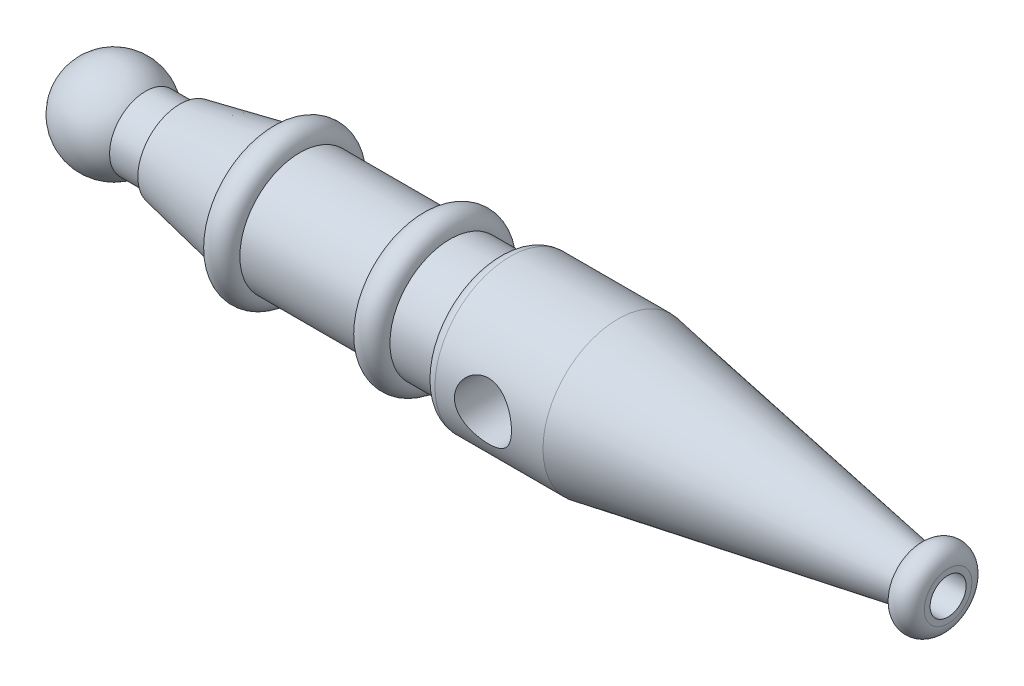
ISO-10303-21;
HEADER;
FILE_DESCRIPTION(('STEP AP214'),'2;1');
FILE_NAME('part.step','',(''),(''),'','','');
FILE_SCHEMA(('AUTOMOTIVE_DESIGN { 1 0 10303 214 1 1 1 1 }'));
ENDSEC;
DATA;
#1=APPLICATION_CONTEXT('core data for automotive mechanical design processes');
#2=APPLICATION_PROTOCOL_DEFINITION('international standard','automotive_design',2000,#1);
#3=PRODUCT_CONTEXT('',#1,'mechanical');
#4=PRODUCT('Part','Part','',(#3));
#5=PRODUCT_RELATED_PRODUCT_CATEGORY('part','',(#4));
#6=PRODUCT_DEFINITION_FORMATION('','',#4);
#7=PRODUCT_DEFINITION_CONTEXT('part definition',#1,'design');
#8=PRODUCT_DEFINITION('design','',#6,#7);
#9=PRODUCT_DEFINITION_SHAPE('','',#8);
#10=(LENGTH_UNIT() NAMED_UNIT(*) SI_UNIT(.MILLI.,.METRE.));
#11=(NAMED_UNIT(*) PLANE_ANGLE_UNIT() SI_UNIT($,.RADIAN.));
#12=(NAMED_UNIT(*) SI_UNIT($,.STERADIAN.) SOLID_ANGLE_UNIT());
#13=UNCERTAINTY_MEASURE_WITH_UNIT(LENGTH_MEASURE(1.E-05),#10,'distance_accuracy_value','');
#14=(GEOMETRIC_REPRESENTATION_CONTEXT(3) GLOBAL_UNCERTAINTY_ASSIGNED_CONTEXT((#13)) GLOBAL_UNIT_ASSIGNED_CONTEXT((#10,
#11,#12)) REPRESENTATION_CONTEXT('',''));
#15=CARTESIAN_POINT('',(0.,0.,0.));
#16=DIRECTION('',(0.,0.,1.));
#17=DIRECTION('',(1.,0.,0.));
#18=AXIS2_PLACEMENT_3D('',#15,#16,#17);
#19=CARTESIAN_POINT('',(-42.8918918918919,0.,0.));
#20=DIRECTION('',(-1.,0.,0.));
#21=DIRECTION('',(0.,1.,0.));
#22=AXIS2_PLACEMENT_3D('',#19,#20,#21);
#23=SPHERICAL_SURFACE('',#22,8.);
#24=CARTESIAN_POINT('',(-37.6003892697627,0.,0.));
#25=DIRECTION('',(-1.,0.,0.));
#26=DIRECTION('',(0.,0.,1.));
#27=AXIS2_PLACEMENT_3D('',#24,#25,#26);
#28=CIRCLE('',#27,6.);
#29=CARTESIAN_POINT('',(-37.6003892697627,0.,6.));
#30=VERTEX_POINT('',#29);
#31=EDGE_CURVE('E122',#30,#30,#28,.T.);
#32=ORIENTED_EDGE('',*,*,#31,.T.);
#33=EDGE_LOOP('',(#32));
#34=FACE_BOUND('',#33,.T.);
#35=ADVANCED_FACE('F37',(#34),#23,.T.);
#36=CARTESIAN_POINT('',(96.1081081081081,0.,0.));
#37=DIRECTION('',(1.,0.,0.));
#38=DIRECTION('',(0.,0.,-1.));
#39=AXIS2_PLACEMENT_3D('',#36,#37,#38);
#40=PLANE('',#39);
#41=CARTESIAN_POINT('',(96.1081081081081,0.,0.));
#42=DIRECTION('',(1.,0.,0.));
#43=DIRECTION('',(0.,0.,-1.));
#44=AXIS2_PLACEMENT_3D('',#41,#42,#43);
#45=CIRCLE('',#44,3.);
#46=CARTESIAN_POINT('',(96.1081081081081,0.,-3.));
#47=VERTEX_POINT('',#46);
#48=EDGE_CURVE('E132',#47,#47,#45,.T.);
#49=ORIENTED_EDGE('',*,*,#48,.F.);
#50=EDGE_LOOP('',(#49));
#51=FACE_BOUND('',#50,.T.);
#52=CARTESIAN_POINT('',(96.1081081081081,0.,0.));
#53=DIRECTION('',(-1.,0.,0.));
#54=DIRECTION('',(0.,0.,1.));
#55=AXIS2_PLACEMENT_3D('',#52,#53,#54);
#56=CIRCLE('',#55,3.95945945945945);
#57=CARTESIAN_POINT('',(96.1081081081081,0.,3.95945945945945));
#58=VERTEX_POINT('',#57);
#59=EDGE_CURVE('E49',#58,#58,#56,.T.);
#60=ORIENTED_EDGE('',*,*,#59,.F.);
#61=EDGE_LOOP('',(#60));
#62=FACE_BOUND('',#61,.T.);
#63=ADVANCED_FACE('F113',(#51,#62),#40,.T.);
#64=CARTESIAN_POINT('',(93.6081081081081,0.,0.));
#65=DIRECTION('',(-1.,0.,0.));
#66=DIRECTION('',(0.,0.,1.));
#67=AXIS2_PLACEMENT_3D('',#64,#65,#66);
#68=TOROIDAL_SURFACE('',#67,3.95945945945945,2.5);
#69=CARTESIAN_POINT('',(91.1081081081081,0.,0.));
#70=DIRECTION('',(-1.,0.,0.));
#71=DIRECTION('',(0.,0.,1.));
#72=AXIS2_PLACEMENT_3D('',#69,#70,#71);
#73=CIRCLE('',#72,3.95945945945945);
#74=CARTESIAN_POINT('',(91.1081081081081,0.,3.95945945945945));
#75=VERTEX_POINT('',#74);
#76=EDGE_CURVE('E53',#75,#75,#73,.T.);
#77=ORIENTED_EDGE('',*,*,#76,.F.);
#78=EDGE_LOOP('',(#77));
#79=FACE_BOUND('',#78,.T.);
#80=ORIENTED_EDGE('',*,*,#59,.T.);
#81=EDGE_LOOP('',(#80));
#82=FACE_BOUND('',#81,.T.);
#83=ADVANCED_FACE('F118',(#79,#82),#68,.T.);
#84=CARTESIAN_POINT('',(41.1081081081081,0.,0.));
#85=DIRECTION('',(-1.,0.,0.));
#86=DIRECTION('',(0.,0.,1.));
#87=AXIS2_PLACEMENT_3D('',#84,#85,#86);
#88=CONICAL_SURFACE('',#87,12.5,0.169178087982728);
#89=CARTESIAN_POINT('',(41.1081081081081,0.,0.));
#90=DIRECTION('',(-1.,0.,0.));
#91=DIRECTION('',(0.,0.,1.));
#92=AXIS2_PLACEMENT_3D('',#89,#90,#91);
#93=CIRCLE('',#92,12.5);
#94=CARTESIAN_POINT('',(41.1081081081081,0.,12.5));
#95=VERTEX_POINT('',#94);
#96=EDGE_CURVE('E157',#95,#95,#93,.T.);
#97=CARTESIAN_POINT('',(91.1081081081081,0.,3.95945945945945));
#98=CARTESIAN_POINT('',(90.5872747747748,0.,4.04842342342341));
#99=CARTESIAN_POINT('',(90.0664414414415,0.,4.13738738738737));
#100=CARTESIAN_POINT('',(89.0247747747748,0.,4.3153153153153));
#101=CARTESIAN_POINT('',(88.5039414414415,0.,4.40427927927927));
#102=CARTESIAN_POINT('',(87.4622747747748,0.,4.5822072072072));
#103=CARTESIAN_POINT('',(86.9414414414415,0.,4.67117117117116));
#104=CARTESIAN_POINT('',(85.8997747747748,0.,4.84909909909909));
#105=CARTESIAN_POINT('',(85.3789414414415,0.,4.93806306306305));
#106=CARTESIAN_POINT('',(84.3372747747748,0.,5.11599099099098));
#107=CARTESIAN_POINT('',(83.8164414414415,0.,5.20495495495494));
#108=CARTESIAN_POINT('',(82.7747747747748,0.,5.38288288288287));
#109=CARTESIAN_POINT('',(82.2539414414415,0.,5.47184684684684));
#110=CARTESIAN_POINT('',(81.2122747747748,0.,5.64977477477476));
#111=CARTESIAN_POINT('',(80.6914414414415,0.,5.73873873873873));
#112=CARTESIAN_POINT('',(79.6497747747748,0.,5.91666666666666));
#113=CARTESIAN_POINT('',(79.1289414414415,0.,6.00563063063062));
#114=CARTESIAN_POINT('',(78.0872747747748,0.,6.18355855855855));
#115=CARTESIAN_POINT('',(77.5664414414415,0.,6.27252252252251));
#116=CARTESIAN_POINT('',(76.5247747747748,0.,6.45045045045044));
#117=CARTESIAN_POINT('',(76.0039414414415,0.,6.5394144144144));
#118=CARTESIAN_POINT('',(74.9622747747748,0.,6.71734234234233));
#119=CARTESIAN_POINT('',(74.4414414414415,0.,6.8063063063063));
#120=CARTESIAN_POINT('',(73.3997747747748,0.,6.98423423423423));
#121=CARTESIAN_POINT('',(72.8789414414415,0.,7.07319819819819));
#122=CARTESIAN_POINT('',(71.8372747747748,0.,7.25112612612612));
#123=CARTESIAN_POINT('',(71.3164414414415,0.,7.34009009009008));
#124=CARTESIAN_POINT('',(70.2747747747748,0.,7.51801801801801));
#125=CARTESIAN_POINT('',(69.7539414414415,0.,7.60698198198197));
#126=CARTESIAN_POINT('',(68.7122747747748,0.,7.7849099099099));
#127=CARTESIAN_POINT('',(68.1914414414415,0.,7.87387387387387));
#128=CARTESIAN_POINT('',(67.1497747747748,0.,8.05180180180179));
#129=CARTESIAN_POINT('',(66.6289414414415,0.,8.14076576576576));
#130=CARTESIAN_POINT('',(65.5872747747748,0.,8.31869369369369));
#131=CARTESIAN_POINT('',(65.0664414414415,0.,8.40765765765765));
#132=CARTESIAN_POINT('',(64.0247747747748,0.,8.58558558558558));
#133=CARTESIAN_POINT('',(63.5039414414415,0.,8.67454954954954));
#134=CARTESIAN_POINT('',(62.4622747747748,0.,8.85247747747747));
#135=CARTESIAN_POINT('',(61.9414414414415,0.,8.94144144144144));
#136=CARTESIAN_POINT('',(60.8997747747748,0.,9.11936936936936));
#137=CARTESIAN_POINT('',(60.3789414414415,0.,9.20833333333333));
#138=CARTESIAN_POINT('',(59.3372747747748,0.,9.38626126126126));
#139=CARTESIAN_POINT('',(58.8164414414415,0.,9.47522522522522));
#140=CARTESIAN_POINT('',(57.7747747747748,0.,9.65315315315315));
#141=CARTESIAN_POINT('',(57.2539414414415,0.,9.74211711711711));
#142=CARTESIAN_POINT('',(56.2122747747748,0.,9.92004504504504));
#143=CARTESIAN_POINT('',(55.6914414414415,0.,10.009009009009));
#144=CARTESIAN_POINT('',(54.6497747747748,0.,10.1869369369369));
#145=CARTESIAN_POINT('',(54.1289414414415,0.,10.2759009009009));
#146=CARTESIAN_POINT('',(53.0872747747748,0.,10.4538288288288));
#147=CARTESIAN_POINT('',(52.5664414414414,0.,10.5427927927928));
#148=CARTESIAN_POINT('',(51.5247747747748,0.,10.7207207207207));
#149=CARTESIAN_POINT('',(51.0039414414414,0.,10.8096846846847));
#150=CARTESIAN_POINT('',(49.9622747747748,0.,10.9876126126126));
#151=CARTESIAN_POINT('',(49.4414414414415,0.,11.0765765765766));
#152=CARTESIAN_POINT('',(48.3997747747748,0.,11.2545045045045));
#153=CARTESIAN_POINT('',(47.8789414414415,0.,11.3434684684685));
#154=CARTESIAN_POINT('',(46.8372747747748,0.,11.5213963963964));
#155=CARTESIAN_POINT('',(46.3164414414415,0.,11.6103603603604));
#156=CARTESIAN_POINT('',(45.2747747747748,0.,11.7882882882883));
#157=CARTESIAN_POINT('',(44.7539414414414,0.,11.8772522522523));
#158=CARTESIAN_POINT('',(43.7122747747748,0.,12.0551801801802));
#159=CARTESIAN_POINT('',(43.1914414414414,0.,12.1441441441441));
#160=CARTESIAN_POINT('',(42.1497747747748,0.,12.3220720720721));
#161=CARTESIAN_POINT('',(41.6289414414414,0.,12.411036036036));
#162=CARTESIAN_POINT('',(41.1081081081081,0.,12.5));
#163=B_SPLINE_CURVE_WITH_KNOTS('',3,(#97,#98,#99,#100,#101,#102,#103,#104,#105,#106,#107,#108,
#109,#110,#111,#112,#113,#114,#115,#116,#117,#118,#119,#120,#121,#122,#123,#124,#125,#126,#127,
#128,#129,#130,#131,#132,#133,#134,#135,#136,#137,#138,#139,#140,#141,#142,#143,#144,#145,#146,
#147,#148,#149,#150,#151,#152,#153,#154,#155,#156,#157,#158,#159,#160,#161,#162),.UNSPECIFIED.,
.F.,.F.,(4,2,2,2,2,2,2,2,2,2,2,2,2,2,2,2,2,2,2,2,2,2,2,2,2,2,2,2,2,2,2,2,4),(0.,
1.58513013092227,3.17026026184453,4.75539039276679,6.34052052368906,7.92565065461132,
9.51078078553359,11.0959109164558,12.6810410473781,14.2661711783004,15.8513013092227,
17.4364314401449,19.0215615710672,20.6066917019894,22.1918218329117,23.776951963834,
25.3620820947562,26.9472122256785,28.5323423566008,30.117472487523,31.7026026184453,
33.2877327493676,34.8728628802898,36.4579930112121,38.0431231421343,39.6282532730566,
41.2133834039789,42.7985135349011,44.3836436658234,45.9687737967457,47.5539039276679,
49.1390340585902,50.7241641895125),.UNSPECIFIED.);
#164=EDGE_CURVE('BSEAM108',#75,#95,#163,.T.);
#165=ORIENTED_EDGE('',*,*,#76,.T.);
#166=ORIENTED_EDGE('',*,*,#96,.F.);
#167=ORIENTED_EDGE('',*,*,#164,.T.);
#168=ORIENTED_EDGE('',*,*,#164,.F.);
#169=EDGE_LOOP('',(#165,#167,#166,#168));
#170=FACE_BOUND('',#169,.T.);
#171=ADVANCED_FACE('F108',(#170),#88,.T.);
#172=CARTESIAN_POINT('',(-66.054054054054,0.,0.));
#173=DIRECTION('',(-1.,0.,0.));
#174=DIRECTION('',(0.,0.,1.));
#175=AXIS2_PLACEMENT_3D('',#172,#173,#174);
#176=CYLINDRICAL_SURFACE('',#175,12.5);
#177=CARTESIAN_POINT('',(35.8581081081081,0.,-12.5));
#178=CARTESIAN_POINT('',(35.8581087826848,-0.128466446938815,-12.5000005012393));
#179=CARTESIAN_POINT('',(35.8528924916972,-0.256923646186463,-12.4980153397341));
#180=CARTESIAN_POINT('',(35.8320799764197,-0.512917273918687,-12.4901287481548));
#181=CARTESIAN_POINT('',(35.8164804911744,-0.64045340040638,-12.4842260877492));
#182=CARTESIAN_POINT('',(35.7750673896663,-0.893546659172997,-12.4686664063571));
#183=CARTESIAN_POINT('',(35.7492594874675,-1.0191048577656,-12.4590114857153));
#184=CARTESIAN_POINT('',(35.6876705805666,-1.26747251190663,-12.436200181148));
#185=CARTESIAN_POINT('',(35.6518856986213,-1.39028087873356,-12.4230424360485));
#186=CARTESIAN_POINT('',(35.5707662960859,-1.63198891229308,-12.3936028937675));
#187=CARTESIAN_POINT('',(35.5254548046733,-1.75089721971284,-12.3773286386008));
#188=CARTESIAN_POINT('',(35.4256185544062,-1.98437662723286,-12.3420509918013));
#189=CARTESIAN_POINT('',(35.3710903783393,-2.09894609929437,-12.3230465883222));
#190=CARTESIAN_POINT('',(35.194298714892,-2.4350590912118,-12.2626315047553));
#191=CARTESIAN_POINT('',(35.0587657364527,-2.64919164725328,-12.2177954028037));
#192=CARTESIAN_POINT('',(34.7502728262016,-3.06037548532479,-12.1214921926306));
#193=CARTESIAN_POINT('',(34.5760552544378,-3.25642969187666,-12.0698341891123));
#194=CARTESIAN_POINT('',(34.1975892321836,-3.61744362733618,-11.9665936986651));
#195=CARTESIAN_POINT('',(33.9933312642633,-3.78239346378752,-11.9150112409209));
#196=CARTESIAN_POINT('',(33.6639063339606,-4.006122592458,-11.8409250924736));
#197=CARTESIAN_POINT('',(33.547806511672,-4.07787277388981,-11.8163429144165));
#198=CARTESIAN_POINT('',(33.3095250889045,-4.2112796562967,-11.7694568811461));
#199=CARTESIAN_POINT('',(33.1873459577191,-4.27294041244833,-11.7471521119508));
#200=CARTESIAN_POINT('',(32.937682731052,-4.38564983408058,-11.7055410175444));
#201=CARTESIAN_POINT('',(32.8101980581324,-4.43669734080586,-11.6862350197976));
#202=CARTESIAN_POINT('',(32.5508896796704,-4.52766449495391,-11.6512930601117));
#203=CARTESIAN_POINT('',(32.4190681171951,-4.56758954884961,-11.6356553156706));
#204=CARTESIAN_POINT('',(32.1575846460733,-4.63449564115211,-11.6091641155722));
#205=CARTESIAN_POINT('',(32.0280598564847,-4.6619447825455,-11.5981391572528));
#206=CARTESIAN_POINT('',(31.7669368658917,-4.70594997128013,-11.5803540613602));
#207=CARTESIAN_POINT('',(31.6353396034326,-4.72251081207374,-11.5735920471276));
#208=CARTESIAN_POINT('',(31.3710877990251,-4.74456721028894,-11.5645676402429));
#209=CARTESIAN_POINT('',(31.2384334305238,-4.75006454691983,-11.5623045240883));
#210=CARTESIAN_POINT('',(30.9731339540443,-4.74993431563227,-11.5623581029648));
#211=CARTESIAN_POINT('',(30.8404888459084,-4.74430719556798,-11.5646746136269));
#212=CARTESIAN_POINT('',(30.5844877964713,-4.72268848101094,-11.5735187896225));
#213=CARTESIAN_POINT('',(30.4610657498162,-4.70736101442423,-11.5797764994281));
#214=CARTESIAN_POINT('',(30.2160051757954,-4.66712733306709,-11.5960507398756));
#215=CARTESIAN_POINT('',(30.094367253725,-4.64221794208397,-11.6060685168763));
#216=CARTESIAN_POINT('',(29.8537551576655,-4.58305985841391,-11.6295560605714));
#217=CARTESIAN_POINT('',(29.7347803092977,-4.54881355976923,-11.6430249423274));
#218=CARTESIAN_POINT('',(29.5001922406967,-4.47128545414173,-11.6730170411612));
#219=CARTESIAN_POINT('',(29.3845803311509,-4.42800017662867,-11.6895414311263));
#220=CARTESIAN_POINT('',(29.0395622220936,-4.28327874939258,-11.7436925243237));
#221=CARTESIAN_POINT('',(28.8163999751633,-4.1680685108215,-11.7854405393756));
#222=CARTESIAN_POINT('',(28.391936279052,-3.90479581255147,-11.8752623575038));
#223=CARTESIAN_POINT('',(28.1906425555844,-3.75672179858852,-11.9233383829602));
#224=CARTESIAN_POINT('',(27.8008219603139,-3.41982015890273,-12.0244668564206));
#225=CARTESIAN_POINT('',(27.6141408113184,-3.22888228789723,-12.0776335228233));
#226=CARTESIAN_POINT('',(27.2749003194523,-2.81781145947518,-12.1800970946688));
#227=CARTESIAN_POINT('',(27.1223465060623,-2.59767378015137,-12.2293933721734));
#228=CARTESIAN_POINT('',(26.8535661698239,-2.12963147248241,-12.3195902543165));
#229=CARTESIAN_POINT('',(26.7379706396213,-1.88133356641681,-12.360341317423));
#230=CARTESIAN_POINT('',(26.5508099293271,-1.36688022548377,-12.4277426608653));
#231=CARTESIAN_POINT('',(26.4792246461215,-1.10073300558122,-12.4543993784726));
#232=CARTESIAN_POINT('',(26.3857044197549,-0.573677479246094,-12.4894688884553));
#233=CARTESIAN_POINT('',(26.3612818215853,-0.313270964982966,-12.4987947222216));
#234=CARTESIAN_POINT('',(26.3555170395629,0.208057225351658,-12.5009838786683));
#235=CARTESIAN_POINT('',(26.3741649975875,0.468978769883671,-12.4938509684776));
#236=CARTESIAN_POINT('',(26.4521324186027,0.97307793695672,-12.4645257652524));
#237=CARTESIAN_POINT('',(26.5098088930462,1.21654883204225,-12.4429421784921));
#238=CARTESIAN_POINT('',(26.6620196421887,1.69017638420406,-12.38750180738));
#239=CARTESIAN_POINT('',(26.7565587050396,1.92033130718159,-12.3536434286722));
#240=CARTESIAN_POINT('',(26.9828415048187,2.36845004238712,-12.2757374233217));
#241=CARTESIAN_POINT('',(27.1156057858238,2.58584961467165,-12.2314173121275));
#242=CARTESIAN_POINT('',(27.4134339847731,2.99602447185313,-12.137470264806));
#243=CARTESIAN_POINT('',(27.5785100482146,3.18879045219183,-12.0878413363678));
#244=CARTESIAN_POINT('',(27.9477957456243,3.55623210606137,-11.985064504796));
#245=CARTESIAN_POINT('',(28.1537513137022,3.72914496745584,-11.9318831544933));
#246=CARTESIAN_POINT('',(28.592940462394,4.03837087571106,-11.8308123502666));
#247=CARTESIAN_POINT('',(28.8261768512422,4.17468014990191,-11.7829234421247));
#248=CARTESIAN_POINT('',(29.1924666044065,4.34871299636099,-11.7193224978098));
#249=CARTESIAN_POINT('',(29.3177222706582,4.40177044148724,-11.6994448738917));
#250=CARTESIAN_POINT('',(29.5727489211335,4.49707330691068,-11.6631444504838));
#251=CARTESIAN_POINT('',(29.7025179493799,4.53932334614442,-11.6467201756163));
#252=CARTESIAN_POINT('',(29.9655832342649,4.61256770312462,-11.6179072708148));
#253=CARTESIAN_POINT('',(30.0988783541278,4.64356560212121,-11.605517356983));
#254=CARTESIAN_POINT('',(30.367977791247,4.69397900786603,-11.5852191698974));
#255=CARTESIAN_POINT('',(30.5037819261215,4.71339535309547,-11.5773105722075));
#256=CARTESIAN_POINT('',(30.7677364114647,4.73952098873367,-11.5666383982182));
#257=CARTESIAN_POINT('',(30.8958003507804,4.74698436529658,-11.5635697011122));
#258=CARTESIAN_POINT('',(31.1521896617085,4.75152604134758,-11.5617043526346));
#259=CARTESIAN_POINT('',(31.2805151068561,4.74860084160406,-11.5629091407203));
#260=CARTESIAN_POINT('',(31.5363363386622,4.73239263611602,-11.5695520918507));
#261=CARTESIAN_POINT('',(31.6638324911517,4.71911456118937,-11.5749882396016));
#262=CARTESIAN_POINT('',(31.9171480940848,4.68234374170501,-11.5899115396728));
#263=CARTESIAN_POINT('',(32.042966894612,4.65884714995236,-11.5994002177163));
#264=CARTESIAN_POINT('',(32.2879134196684,4.60280569614165,-11.6217493591521));
#265=CARTESIAN_POINT('',(32.4071254865411,4.57058127757041,-11.6344896300873));
#266=CARTESIAN_POINT('',(32.6423569012911,4.49708671459059,-11.6630938751032));
#267=CARTESIAN_POINT('',(32.7583751162832,4.45581340583946,-11.6789589417085));
#268=CARTESIAN_POINT('',(33.1005427226305,4.31890542711458,-11.7305847438558));
#269=CARTESIAN_POINT('',(33.320986688609,4.21014074671157,-11.7703937023547));
#270=CARTESIAN_POINT('',(33.7526824948946,3.95413108187676,-11.8589251576371));
#271=CARTESIAN_POINT('',(33.962814161327,3.80514081966396,-11.9080102201227));
#272=CARTESIAN_POINT('',(34.3561654802551,3.47540026707772,-12.0083800053119));
#273=CARTESIAN_POINT('',(34.5393764285961,3.29463974587396,-12.0596654325553));
#274=CARTESIAN_POINT('',(34.7954012006064,2.99746860333467,-12.1357522409645));
#275=CARTESIAN_POINT('',(34.8795470817546,2.89088551968471,-12.1616429270626));
#276=CARTESIAN_POINT('',(35.0385516762022,2.67067948767235,-12.2118876888598));
#277=CARTESIAN_POINT('',(35.1134137737133,2.55705912738511,-12.2362423228947));
#278=CARTESIAN_POINT('',(35.2533237796015,2.32341236076621,-12.2827502759549));
#279=CARTESIAN_POINT('',(35.3183660117062,2.20338230322347,-12.304902319289));
#280=CARTESIAN_POINT('',(35.4380160638499,1.95781549313792,-12.3463538942417));
#281=CARTESIAN_POINT('',(35.4926282814655,1.83228108895004,-12.3656546272692));
#282=CARTESIAN_POINT('',(35.5936613591319,1.56946177531019,-12.4018279997747));
#283=CARTESIAN_POINT('',(35.639462152175,1.43191096979924,-12.4185073179799));
#284=CARTESIAN_POINT('',(35.7183685538687,1.15282973759642,-12.4475159966159));
#285=CARTESIAN_POINT('',(35.7514797768036,1.01130110064607,-12.459847280567));
#286=CARTESIAN_POINT('',(35.8046241767849,0.725505468548198,-12.4797498090044));
#287=CARTESIAN_POINT('',(35.8246599564179,0.58123902423101,-12.4873220007477));
#288=CARTESIAN_POINT('',(35.8514006829041,0.291310969774447,-12.4974464894756));
#289=CARTESIAN_POINT('',(35.8581073433031,0.145649541388969,-12.4999994317171));
#290=CARTESIAN_POINT('',(35.8581081081081,0.,-12.5));
#291=B_SPLINE_CURVE_WITH_KNOTS('',3,(#177,#178,#179,#180,#181,#182,#183,#184,#185,#186,#187,
#188,#189,#190,#191,#192,#193,#194,#195,#196,#197,#198,#199,#200,#201,#202,#203,#204,#205,#206,
#207,#208,#209,#210,#211,#212,#213,#214,#215,#216,#217,#218,#219,#220,#221,#222,#223,#224,#225,
#226,#227,#228,#229,#230,#231,#232,#233,#234,#235,#236,#237,#238,#239,#240,#241,#242,#243,#244,
#245,#246,#247,#248,#249,#250,#251,#252,#253,#254,#255,#256,#257,#258,#259,#260,#261,#262,#263,
#264,#265,#266,#267,#268,#269,#270,#271,#272,#273,#274,#275,#276,#277,#278,#279,#280,#281,#282,
#283,#284,#285,#286,#287,#288,#289,#290),.UNSPECIFIED.,.T.,.F.,(4,2,2,2,2,2,2,2,2,2,2,2,2,2,2,2,
2,2,2,2,2,2,2,2,2,2,2,2,2,2,2,2,2,2,2,2,2,2,2,2,2,2,2,2,2,2,2,2,2,2,2,2,2,2,2,2,4),(0.,
0.385262777799974,0.77064660870562,1.15581502924361,1.541133342657,1.9255307003372,
2.31007089250849,3.07856982350732,3.87715861657318,4.67600096659891,5.0916053736829,
5.50704232710943,5.92252461418109,6.3378045871693,6.73586392525798,7.13374790463235,
7.53156789203284,7.92937186411553,8.30251559168309,8.67578311552742,9.04895502107773,
9.42227047088333,10.1824862468386,10.9429697244626,11.7560474568173,12.5692568328079,
13.3956885513754,14.221742489313,15.0028882340516,15.7838552054487,16.5338374469207,
17.2839171374857,18.0562494365395,18.8288726027406,19.6475421200436,20.4662959838728,
20.8782711750289,21.2900699983604,21.7017376421742,22.1133754784596,22.4978452931976,
22.8824446229406,23.2668608893628,23.6514220110901,24.0234283181464,24.395564921657,
25.139282934915,25.922731508458,26.706432836138,27.1207428294027,27.5349013477699,
27.9492983570996,28.3635202578181,28.8006508375199,29.2375877923426,29.6744377510004,
30.1112315460956),.UNSPECIFIED.);
#292=CARTESIAN_POINT('',(35.8581081081081,0.,-12.5));
#293=VERTEX_POINT('',#292);
#294=EDGE_CURVE('E40',#293,#293,#291,.T.);
#295=ORIENTED_EDGE('',*,*,#294,.F.);
#296=EDGE_LOOP('',(#295));
#297=FACE_BOUND('',#296,.T.);
#298=CARTESIAN_POINT('',(35.8581081081081,0.,12.5));
#299=CARTESIAN_POINT('',(35.8581087826848,0.128466446938815,12.5000005012393));
#300=CARTESIAN_POINT('',(35.8528924916972,0.256923646186463,12.4980153397341));
#301=CARTESIAN_POINT('',(35.8320799764197,0.512917273918687,12.4901287481548));
#302=CARTESIAN_POINT('',(35.8164804911744,0.64045340040638,12.4842260877492));
#303=CARTESIAN_POINT('',(35.7750673896663,0.893546659172997,12.4686664063571));
#304=CARTESIAN_POINT('',(35.7492594874675,1.0191048577656,12.4590114857153));
#305=CARTESIAN_POINT('',(35.6876705805666,1.26747251190663,12.436200181148));
#306=CARTESIAN_POINT('',(35.6518856986213,1.39028087873356,12.4230424360485));
#307=CARTESIAN_POINT('',(35.5707662960859,1.63198891229308,12.3936028937675));
#308=CARTESIAN_POINT('',(35.5254548046733,1.75089721971284,12.3773286386008));
#309=CARTESIAN_POINT('',(35.4256185544062,1.98437662723286,12.3420509918013));
#310=CARTESIAN_POINT('',(35.3710903783393,2.09894609929437,12.3230465883222));
#311=CARTESIAN_POINT('',(35.194298714892,2.4350590912118,12.2626315047553));
#312=CARTESIAN_POINT('',(35.0587657364527,2.64919164725328,12.2177954028037));
#313=CARTESIAN_POINT('',(34.7502728262016,3.06037548532479,12.1214921926306));
#314=CARTESIAN_POINT('',(34.5760552544378,3.25642969187666,12.0698341891123));
#315=CARTESIAN_POINT('',(34.1975892321836,3.61744362733618,11.9665936986651));
#316=CARTESIAN_POINT('',(33.9933312642633,3.78239346378752,11.9150112409209));
#317=CARTESIAN_POINT('',(33.6639063339606,4.006122592458,11.8409250924736));
#318=CARTESIAN_POINT('',(33.547806511672,4.07787277388981,11.8163429144165));
#319=CARTESIAN_POINT('',(33.3095250889045,4.2112796562967,11.7694568811461));
#320=CARTESIAN_POINT('',(33.1873459577191,4.27294041244833,11.7471521119508));
#321=CARTESIAN_POINT('',(32.937682731052,4.38564983408058,11.7055410175444));
#322=CARTESIAN_POINT('',(32.8101980581324,4.43669734080586,11.6862350197976));
#323=CARTESIAN_POINT('',(32.5508896796704,4.52766449495391,11.6512930601117));
#324=CARTESIAN_POINT('',(32.4190681171951,4.56758954884961,11.6356553156706));
#325=CARTESIAN_POINT('',(32.1575846460733,4.63449564115211,11.6091641155722));
#326=CARTESIAN_POINT('',(32.0280598564847,4.6619447825455,11.5981391572528));
#327=CARTESIAN_POINT('',(31.7669368658917,4.70594997128013,11.5803540613602));
#328=CARTESIAN_POINT('',(31.6353396034326,4.72251081207374,11.5735920471276));
#329=CARTESIAN_POINT('',(31.3710877990251,4.74456721028894,11.5645676402429));
#330=CARTESIAN_POINT('',(31.2384334305238,4.75006454691983,11.5623045240883));
#331=CARTESIAN_POINT('',(30.9731339540443,4.74993431563227,11.5623581029648));
#332=CARTESIAN_POINT('',(30.8404888459084,4.74430719556798,11.5646746136269));
#333=CARTESIAN_POINT('',(30.5844877964713,4.72268848101094,11.5735187896225));
#334=CARTESIAN_POINT('',(30.4610657498162,4.70736101442423,11.5797764994281));
#335=CARTESIAN_POINT('',(30.2160051757954,4.66712733306709,11.5960507398756));
#336=CARTESIAN_POINT('',(30.094367253725,4.64221794208397,11.6060685168763));
#337=CARTESIAN_POINT('',(29.8537551576655,4.58305985841391,11.6295560605714));
#338=CARTESIAN_POINT('',(29.7347803092977,4.54881355976923,11.6430249423274));
#339=CARTESIAN_POINT('',(29.5001922406967,4.47128545414173,11.6730170411612));
#340=CARTESIAN_POINT('',(29.3845803311509,4.42800017662867,11.6895414311263));
#341=CARTESIAN_POINT('',(29.0395622220936,4.28327874939258,11.7436925243237));
#342=CARTESIAN_POINT('',(28.8163999751633,4.1680685108215,11.7854405393756));
#343=CARTESIAN_POINT('',(28.391936279052,3.90479581255147,11.8752623575038));
#344=CARTESIAN_POINT('',(28.1906425555844,3.75672179858852,11.9233383829602));
#345=CARTESIAN_POINT('',(27.8008219603139,3.41982015890273,12.0244668564206));
#346=CARTESIAN_POINT('',(27.6141408113184,3.22888228789723,12.0776335228233));
#347=CARTESIAN_POINT('',(27.2749003194523,2.81781145947518,12.1800970946688));
#348=CARTESIAN_POINT('',(27.1223465060623,2.59767378015137,12.2293933721734));
#349=CARTESIAN_POINT('',(26.8535661698239,2.12963147248241,12.3195902543165));
#350=CARTESIAN_POINT('',(26.7379706396213,1.88133356641681,12.360341317423));
#351=CARTESIAN_POINT('',(26.5508099293271,1.36688022548377,12.4277426608653));
#352=CARTESIAN_POINT('',(26.4792246461215,1.10073300558122,12.4543993784726));
#353=CARTESIAN_POINT('',(26.3857044197549,0.573677479246094,12.4894688884553));
#354=CARTESIAN_POINT('',(26.3612818215853,0.313270964982966,12.4987947222216));
#355=CARTESIAN_POINT('',(26.3555170395629,-0.208057225351658,12.5009838786683));
#356=CARTESIAN_POINT('',(26.3741649975875,-0.468978769883671,12.4938509684776));
#357=CARTESIAN_POINT('',(26.4521324186027,-0.97307793695672,12.4645257652524));
#358=CARTESIAN_POINT('',(26.5098088930462,-1.21654883204225,12.4429421784921));
#359=CARTESIAN_POINT('',(26.6620196421887,-1.69017638420406,12.38750180738));
#360=CARTESIAN_POINT('',(26.7565587050396,-1.92033130718159,12.3536434286722));
#361=CARTESIAN_POINT('',(26.9828415048187,-2.36845004238712,12.2757374233217));
#362=CARTESIAN_POINT('',(27.1156057858238,-2.58584961467165,12.2314173121275));
#363=CARTESIAN_POINT('',(27.4134339847731,-2.99602447185313,12.137470264806));
#364=CARTESIAN_POINT('',(27.5785100482146,-3.18879045219183,12.0878413363678));
#365=CARTESIAN_POINT('',(27.9477957456243,-3.55623210606137,11.985064504796));
#366=CARTESIAN_POINT('',(28.1537513137022,-3.72914496745584,11.9318831544933));
#367=CARTESIAN_POINT('',(28.592940462394,-4.03837087571106,11.8308123502666));
#368=CARTESIAN_POINT('',(28.8261768512422,-4.17468014990191,11.7829234421247));
#369=CARTESIAN_POINT('',(29.1924666044065,-4.34871299636099,11.7193224978098));
#370=CARTESIAN_POINT('',(29.3177222706582,-4.40177044148724,11.6994448738917));
#371=CARTESIAN_POINT('',(29.5727489211335,-4.49707330691068,11.6631444504838));
#372=CARTESIAN_POINT('',(29.7025179493799,-4.53932334614442,11.6467201756163));
#373=CARTESIAN_POINT('',(29.9655832342649,-4.61256770312462,11.6179072708148));
#374=CARTESIAN_POINT('',(30.0988783541278,-4.64356560212121,11.605517356983));
#375=CARTESIAN_POINT('',(30.367977791247,-4.69397900786603,11.5852191698974));
#376=CARTESIAN_POINT('',(30.5037819261215,-4.71339535309547,11.5773105722075));
#377=CARTESIAN_POINT('',(30.7677364114647,-4.73952098873367,11.5666383982182));
#378=CARTESIAN_POINT('',(30.8958003507804,-4.74698436529658,11.5635697011122));
#379=CARTESIAN_POINT('',(31.1521896617085,-4.75152604134758,11.5617043526346));
#380=CARTESIAN_POINT('',(31.2805151068561,-4.74860084160406,11.5629091407203));
#381=CARTESIAN_POINT('',(31.5363363386622,-4.73239263611602,11.5695520918507));
#382=CARTESIAN_POINT('',(31.6638324911517,-4.71911456118937,11.5749882396016));
#383=CARTESIAN_POINT('',(31.9171480940848,-4.68234374170501,11.5899115396728));
#384=CARTESIAN_POINT('',(32.042966894612,-4.65884714995236,11.5994002177163));
#385=CARTESIAN_POINT('',(32.2879134196684,-4.60280569614165,11.6217493591521));
#386=CARTESIAN_POINT('',(32.4071254865411,-4.57058127757041,11.6344896300873));
#387=CARTESIAN_POINT('',(32.6423569012911,-4.49708671459059,11.6630938751032));
#388=CARTESIAN_POINT('',(32.7583751162832,-4.45581340583946,11.6789589417085));
#389=CARTESIAN_POINT('',(33.1005427226305,-4.31890542711458,11.7305847438558));
#390=CARTESIAN_POINT('',(33.320986688609,-4.21014074671157,11.7703937023547));
#391=CARTESIAN_POINT('',(33.7526824948946,-3.95413108187676,11.8589251576371));
#392=CARTESIAN_POINT('',(33.962814161327,-3.80514081966396,11.9080102201227));
#393=CARTESIAN_POINT('',(34.3561654802551,-3.47540026707772,12.0083800053119));
#394=CARTESIAN_POINT('',(34.5393764285961,-3.29463974587396,12.0596654325553));
#395=CARTESIAN_POINT('',(34.7954012006064,-2.99746860333467,12.1357522409645));
#396=CARTESIAN_POINT('',(34.8795470817546,-2.89088551968471,12.1616429270626));
#397=CARTESIAN_POINT('',(35.0385516762022,-2.67067948767235,12.2118876888598));
#398=CARTESIAN_POINT('',(35.1134137737133,-2.55705912738511,12.2362423228947));
#399=CARTESIAN_POINT('',(35.2533237796015,-2.32341236076621,12.2827502759549));
#400=CARTESIAN_POINT('',(35.3183660117062,-2.20338230322347,12.304902319289));
#401=CARTESIAN_POINT('',(35.4380160638499,-1.95781549313792,12.3463538942417));
#402=CARTESIAN_POINT('',(35.4926282814655,-1.83228108895004,12.3656546272692));
#403=CARTESIAN_POINT('',(35.5936613591319,-1.56946177531019,12.4018279997747));
#404=CARTESIAN_POINT('',(35.639462152175,-1.43191096979924,12.4185073179799));
#405=CARTESIAN_POINT('',(35.7183685538687,-1.15282973759642,12.4475159966159));
#406=CARTESIAN_POINT('',(35.7514797768036,-1.01130110064607,12.459847280567));
#407=CARTESIAN_POINT('',(35.8046241767849,-0.725505468548198,12.4797498090044));
#408=CARTESIAN_POINT('',(35.8246599564179,-0.58123902423101,12.4873220007477));
#409=CARTESIAN_POINT('',(35.8514006829041,-0.291310969774447,12.4974464894756));
#410=CARTESIAN_POINT('',(35.8581073433031,-0.145649541388969,12.4999994317171));
#411=CARTESIAN_POINT('',(35.8581081081081,0.,12.5));
#412=B_SPLINE_CURVE_WITH_KNOTS('',3,(#298,#299,#300,#301,#302,#303,#304,#305,#306,#307,#308,
#309,#310,#311,#312,#313,#314,#315,#316,#317,#318,#319,#320,#321,#322,#323,#324,#325,#326,#327,
#328,#329,#330,#331,#332,#333,#334,#335,#336,#337,#338,#339,#340,#341,#342,#343,#344,#345,#346,
#347,#348,#349,#350,#351,#352,#353,#354,#355,#356,#357,#358,#359,#360,#361,#362,#363,#364,#365,
#366,#367,#368,#369,#370,#371,#372,#373,#374,#375,#376,#377,#378,#379,#380,#381,#382,#383,#384,
#385,#386,#387,#388,#389,#390,#391,#392,#393,#394,#395,#396,#397,#398,#399,#400,#401,#402,#403,
#404,#405,#406,#407,#408,#409,#410,#411),.UNSPECIFIED.,.T.,.F.,(4,2,2,2,2,2,2,2,2,2,2,2,2,2,2,2,
2,2,2,2,2,2,2,2,2,2,2,2,2,2,2,2,2,2,2,2,2,2,2,2,2,2,2,2,2,2,2,2,2,2,2,2,2,2,2,2,4),(0.,
0.385262777799974,0.77064660870562,1.15581502924361,1.541133342657,1.9255307003372,
2.31007089250849,3.07856982350732,3.87715861657318,4.67600096659891,5.0916053736829,
5.50704232710943,5.92252461418109,6.3378045871693,6.73586392525798,7.13374790463235,
7.53156789203284,7.92937186411553,8.30251559168309,8.67578311552742,9.04895502107773,
9.42227047088333,10.1824862468386,10.9429697244626,11.7560474568173,12.5692568328079,
13.3956885513754,14.221742489313,15.0028882340516,15.7838552054487,16.5338374469207,
17.2839171374857,18.0562494365395,18.8288726027406,19.6475421200436,20.4662959838728,
20.8782711750289,21.2900699983604,21.7017376421742,22.1133754784596,22.4978452931976,
22.8824446229406,23.2668608893628,23.6514220110901,24.0234283181464,24.395564921657,
25.139282934915,25.922731508458,26.706432836138,27.1207428294027,27.5349013477699,
27.9492983570996,28.3635202578181,28.8006508375199,29.2375877923426,29.6744377510004,
30.1112315460956),.UNSPECIFIED.);
#413=CARTESIAN_POINT('',(35.8581081081081,0.,12.5));
#414=VERTEX_POINT('',#413);
#415=EDGE_CURVE('E10',#414,#414,#412,.T.);
#416=ORIENTED_EDGE('',*,*,#415,.F.);
#417=EDGE_LOOP('',(#416));
#418=FACE_BOUND('',#417,.T.);
#419=ORIENTED_EDGE('',*,*,#96,.T.);
#420=EDGE_LOOP('',(#419));
#421=FACE_BOUND('',#420,.T.);
#422=CARTESIAN_POINT('',(23.1081081081081,0.,0.));
#423=DIRECTION('',(-1.,0.,0.));
#424=DIRECTION('',(0.,0.,1.));
#425=AXIS2_PLACEMENT_3D('',#422,#423,#424);
#426=CIRCLE('',#425,12.5);
#427=CARTESIAN_POINT('',(23.1081081081081,0.,12.5));
#428=VERTEX_POINT('',#427);
#429=EDGE_CURVE('E155',#428,#428,#426,.T.);
#430=ORIENTED_EDGE('',*,*,#429,.F.);
#431=EDGE_LOOP('',(#430));
#432=FACE_BOUND('',#431,.T.);
#433=ADVANCED_FACE('F59',(#297,#418,#421,#432),#176,.T.);
#434=CARTESIAN_POINT('',(23.1081081081081,0.,0.));
#435=DIRECTION('',(-1.,0.,0.));
#436=DIRECTION('',(0.,0.,1.));
#437=AXIS2_PLACEMENT_3D('',#434,#435,#436);
#438=TOROIDAL_SURFACE('',#437,10.5,2.);
#439=ORIENTED_EDGE('',*,*,#429,.T.);
#440=EDGE_LOOP('',(#439));
#441=FACE_BOUND('',#440,.T.);
#442=CARTESIAN_POINT('',(21.1081081081081,0.,0.));
#443=DIRECTION('',(-1.,0.,0.));
#444=DIRECTION('',(0.,0.,1.));
#445=AXIS2_PLACEMENT_3D('',#442,#443,#444);
#446=CIRCLE('',#445,10.5);
#447=CARTESIAN_POINT('',(21.1081081081081,0.,10.5));
#448=VERTEX_POINT('',#447);
#449=EDGE_CURVE('E152',#448,#448,#446,.T.);
#450=ORIENTED_EDGE('',*,*,#449,.F.);
#451=EDGE_LOOP('',(#450));
#452=FACE_BOUND('',#451,.T.);
#453=ADVANCED_FACE('F101',(#441,#452),#438,.T.);
#454=CARTESIAN_POINT('',(21.1081081081081,0.,0.));
#455=DIRECTION('',(1.,0.,0.));
#456=DIRECTION('',(0.,0.,-1.));
#457=AXIS2_PLACEMENT_3D('',#454,#455,#456);
#458=PLANE('',#457);
#459=CARTESIAN_POINT('',(21.1081081081081,0.,0.));
#460=DIRECTION('',(-1.,0.,0.));
#461=DIRECTION('',(0.,0.,1.));
#462=AXIS2_PLACEMENT_3D('',#459,#460,#461);
#463=CIRCLE('',#462,10.);
#464=CARTESIAN_POINT('',(21.1081081081081,0.,10.));
#465=VERTEX_POINT('',#464);
#466=EDGE_CURVE('E149',#465,#465,#463,.T.);
#467=ORIENTED_EDGE('',*,*,#466,.F.);
#468=EDGE_LOOP('',(#467));
#469=FACE_BOUND('',#468,.T.);
#470=ORIENTED_EDGE('',*,*,#449,.T.);
#471=EDGE_LOOP('',(#470));
#472=FACE_BOUND('',#471,.T.);
#473=ADVANCED_FACE('F98',(#469,#472),#458,.F.);
#474=CARTESIAN_POINT('',(-66.054054054054,0.,0.));
#475=DIRECTION('',(-1.,0.,0.));
#476=DIRECTION('',(0.,0.,1.));
#477=AXIS2_PLACEMENT_3D('',#474,#475,#476);
#478=CYLINDRICAL_SURFACE('',#477,10.);
#479=ORIENTED_EDGE('',*,*,#466,.T.);
#480=EDGE_LOOP('',(#479));
#481=FACE_BOUND('',#480,.T.);
#482=CARTESIAN_POINT('',(13.1081081081081,0.,0.));
#483=DIRECTION('',(-1.,0.,0.));
#484=DIRECTION('',(0.,0.,1.));
#485=AXIS2_PLACEMENT_3D('',#482,#483,#484);
#486=CIRCLE('',#485,10.);
#487=CARTESIAN_POINT('',(13.1081081081081,0.,10.));
#488=VERTEX_POINT('',#487);
#489=EDGE_CURVE('E146',#488,#488,#486,.T.);
#490=ORIENTED_EDGE('',*,*,#489,.F.);
#491=EDGE_LOOP('',(#490));
#492=FACE_BOUND('',#491,.T.);
#493=ADVANCED_FACE('F94',(#481,#492),#478,.T.);
#494=CARTESIAN_POINT('',(10.6081081081081,0.,0.));
#495=DIRECTION('',(-1.,0.,0.));
#496=DIRECTION('',(0.,0.,1.));
#497=AXIS2_PLACEMENT_3D('',#494,#495,#496);
#498=TOROIDAL_SURFACE('',#497,10.,2.5);
#499=CARTESIAN_POINT('',(8.10810810810811,0.,0.));
#500=DIRECTION('',(-1.,0.,0.));
#501=DIRECTION('',(0.,0.,1.));
#502=AXIS2_PLACEMENT_3D('',#499,#500,#501);
#503=CIRCLE('',#502,10.);
#504=CARTESIAN_POINT('',(8.10810810810811,0.,10.));
#505=VERTEX_POINT('',#504);
#506=EDGE_CURVE('E143',#505,#505,#503,.T.);
#507=ORIENTED_EDGE('',*,*,#506,.F.);
#508=EDGE_LOOP('',(#507));
#509=FACE_BOUND('',#508,.T.);
#510=ORIENTED_EDGE('',*,*,#489,.T.);
#511=EDGE_LOOP('',(#510));
#512=FACE_BOUND('',#511,.T.);
#513=ADVANCED_FACE('F90',(#509,#512),#498,.T.);
#514=CARTESIAN_POINT('',(-66.054054054054,0.,0.));
#515=DIRECTION('',(-1.,0.,0.));
#516=DIRECTION('',(0.,0.,1.));
#517=AXIS2_PLACEMENT_3D('',#514,#515,#516);
#518=CYLINDRICAL_SURFACE('',#517,10.);
#519=ORIENTED_EDGE('',*,*,#506,.T.);
#520=EDGE_LOOP('',(#519));
#521=FACE_BOUND('',#520,.T.);
#522=CARTESIAN_POINT('',(-11.8918918918919,0.,0.));
#523=DIRECTION('',(-1.,0.,0.));
#524=DIRECTION('',(0.,0.,1.));
#525=AXIS2_PLACEMENT_3D('',#522,#523,#524);
#526=CIRCLE('',#525,10.);
#527=CARTESIAN_POINT('',(-11.8918918918919,0.,10.));
#528=VERTEX_POINT('',#527);
#529=EDGE_CURVE('E140',#528,#528,#526,.T.);
#530=ORIENTED_EDGE('',*,*,#529,.F.);
#531=EDGE_LOOP('',(#530));
#532=FACE_BOUND('',#531,.T.);
#533=ADVANCED_FACE('F86',(#521,#532),#518,.T.);
#534=CARTESIAN_POINT('',(-14.3918918918919,0.,0.));
#535=DIRECTION('',(-1.,0.,0.));
#536=DIRECTION('',(0.,0.,1.));
#537=AXIS2_PLACEMENT_3D('',#534,#535,#536);
#538=TOROIDAL_SURFACE('',#537,10.,2.5);
#539=CARTESIAN_POINT('',(-16.8918918918919,0.,0.));
#540=DIRECTION('',(-1.,0.,0.));
#541=DIRECTION('',(0.,0.,1.));
#542=AXIS2_PLACEMENT_3D('',#539,#540,#541);
#543=CIRCLE('',#542,10.);
#544=CARTESIAN_POINT('',(-16.8918918918919,0.,10.));
#545=VERTEX_POINT('',#544);
#546=EDGE_CURVE('E137',#545,#545,#543,.T.);
#547=ORIENTED_EDGE('',*,*,#546,.F.);
#548=EDGE_LOOP('',(#547));
#549=FACE_BOUND('',#548,.T.);
#550=ORIENTED_EDGE('',*,*,#529,.T.);
#551=EDGE_LOOP('',(#550));
#552=FACE_BOUND('',#551,.T.);
#553=ADVANCED_FACE('F82',(#549,#552),#538,.T.);
#554=CARTESIAN_POINT('',(-31.8918918918919,0.,0.));
#555=DIRECTION('',(1.,0.,0.));
#556=DIRECTION('',(0.,0.,-1.));
#557=AXIS2_PLACEMENT_3D('',#554,#555,#556);
#558=CONICAL_SURFACE('',#557,7.,0.197395559849881);
#559=ORIENTED_EDGE('',*,*,#546,.T.);
#560=EDGE_LOOP('',(#559));
#561=FACE_BOUND('',#560,.T.);
#562=CARTESIAN_POINT('',(-31.8918918918919,0.,0.));
#563=DIRECTION('',(-1.,0.,0.));
#564=DIRECTION('',(0.,0.,1.));
#565=AXIS2_PLACEMENT_3D('',#562,#563,#564);
#566=CIRCLE('',#565,7.);
#567=CARTESIAN_POINT('',(-31.8918918918919,0.,7.));
#568=VERTEX_POINT('',#567);
#569=EDGE_CURVE('E127',#568,#568,#566,.T.);
#570=ORIENTED_EDGE('',*,*,#569,.F.);
#571=EDGE_LOOP('',(#570));
#572=FACE_BOUND('',#571,.T.);
#573=ADVANCED_FACE('F78',(#561,#572),#558,.T.);
#574=CARTESIAN_POINT('',(-31.8918918918919,0.,0.));
#575=DIRECTION('',(-1.,0.,0.));
#576=DIRECTION('',(0.,0.,1.));
#577=AXIS2_PLACEMENT_3D('',#574,#575,#576);
#578=PLANE('',#577);
#579=ORIENTED_EDGE('',*,*,#569,.T.);
#580=EDGE_LOOP('',(#579));
#581=FACE_BOUND('',#580,.T.);
#582=CARTESIAN_POINT('',(-31.8918918918919,0.,0.));
#583=DIRECTION('',(-1.,0.,0.));
#584=DIRECTION('',(0.,0.,1.));
#585=AXIS2_PLACEMENT_3D('',#582,#583,#584);
#586=CIRCLE('',#585,6.);
#587=CARTESIAN_POINT('',(-31.8918918918919,0.,6.));
#588=VERTEX_POINT('',#587);
#589=EDGE_CURVE('E124',#588,#588,#586,.T.);
#590=ORIENTED_EDGE('',*,*,#589,.F.);
#591=EDGE_LOOP('',(#590));
#592=FACE_BOUND('',#591,.T.);
#593=ADVANCED_FACE('F74',(#581,#592),#578,.T.);
#594=CARTESIAN_POINT('',(-66.054054054054,0.,0.));
#595=DIRECTION('',(-1.,0.,0.));
#596=DIRECTION('',(0.,0.,1.));
#597=AXIS2_PLACEMENT_3D('',#594,#595,#596);
#598=CYLINDRICAL_SURFACE('',#597,6.);
#599=ORIENTED_EDGE('',*,*,#589,.T.);
#600=EDGE_LOOP('',(#599));
#601=FACE_BOUND('',#600,.T.);
#602=ORIENTED_EDGE('',*,*,#31,.F.);
#603=EDGE_LOOP('',(#602));
#604=FACE_BOUND('',#603,.T.);
#605=ADVANCED_FACE('F69',(#601,#604),#598,.T.);
#606=CARTESIAN_POINT('',(31.1081081081081,0.,-16.5));
#607=DIRECTION('',(0.,0.,1.));
#608=DIRECTION('',(1.,0.,0.));
#609=AXIS2_PLACEMENT_3D('',#606,#607,#608);
#610=CYLINDRICAL_SURFACE('',#609,4.75);
#611=ORIENTED_EDGE('',*,*,#415,.T.);
#612=EDGE_LOOP('',(#611));
#613=FACE_BOUND('',#612,.T.);
#614=ORIENTED_EDGE('',*,*,#294,.T.);
#615=EDGE_LOOP('',(#614));
#616=FACE_BOUND('',#615,.T.);
#617=ADVANCED_FACE('F63',(#613,#616),#610,.F.);
#618=CARTESIAN_POINT('',(46.1081081081081,0.,0.));
#619=DIRECTION('',(1.,0.,0.));
#620=DIRECTION('',(0.,0.,-1.));
#621=AXIS2_PLACEMENT_3D('',#618,#619,#620);
#622=CYLINDRICAL_SURFACE('',#621,3.);
#623=CARTESIAN_POINT('',(46.1081081081081,0.,0.));
#624=DIRECTION('',(1.,0.,0.));
#625=DIRECTION('',(0.,0.,-1.));
#626=AXIS2_PLACEMENT_3D('',#623,#624,#625);
#627=CIRCLE('',#626,3.);
#628=CARTESIAN_POINT('',(46.1081081081081,0.,-3.));
#629=VERTEX_POINT('',#628);
#630=EDGE_CURVE('E130',#629,#629,#627,.T.);
#631=ORIENTED_EDGE('',*,*,#630,.F.);
#632=EDGE_LOOP('',(#631));
#633=FACE_BOUND('',#632,.T.);
#634=ORIENTED_EDGE('',*,*,#48,.T.);
#635=EDGE_LOOP('',(#634));
#636=FACE_BOUND('',#635,.T.);
#637=ADVANCED_FACE('F68',(#633,#636),#622,.F.);
#638=CARTESIAN_POINT('',(46.1081081081081,0.,0.));
#639=DIRECTION('',(1.,0.,0.));
#640=DIRECTION('',(0.,0.,-1.));
#641=AXIS2_PLACEMENT_3D('',#638,#639,#640);
#642=PLANE('',#641);
#643=ORIENTED_EDGE('',*,*,#630,.T.);
#644=EDGE_LOOP('',(#643));
#645=FACE_BOUND('',#644,.T.);
#646=ADVANCED_FACE('F209',(#645),#642,.T.);
#647=CLOSED_SHELL('',(#35,#63,#83,#171,#433,#453,#473,#493,#513,#533,#553,#573,#593,#605,#617,
#637,#646));
#648=MANIFOLD_SOLID_BREP('B2',#647);
#649=ADVANCED_BREP_SHAPE_REPRESENTATION('',(#18,#648),#14);
#650=SHAPE_DEFINITION_REPRESENTATION(#9,#649);
ENDSEC;
END-ISO-10303-21;
